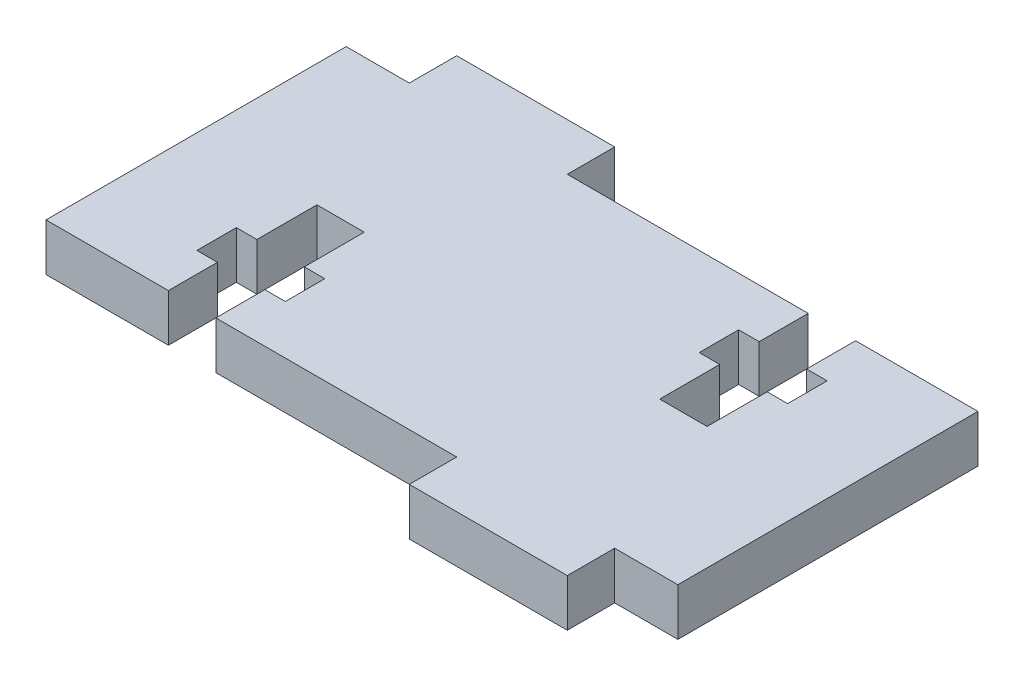
ISO-10303-21;
HEADER;
FILE_DESCRIPTION(('STEP AP214'),'2;1');
FILE_NAME('part.step','',(''),(''),'','','');
FILE_SCHEMA(('AUTOMOTIVE_DESIGN { 1 0 10303 214 1 1 1 1 }'));
ENDSEC;
DATA;
#1=APPLICATION_CONTEXT('core data for automotive mechanical design processes');
#2=APPLICATION_PROTOCOL_DEFINITION('international standard','automotive_design',2000,#1);
#3=PRODUCT_CONTEXT('',#1,'mechanical');
#4=PRODUCT('Part','Part','',(#3));
#5=PRODUCT_RELATED_PRODUCT_CATEGORY('part','',(#4));
#6=PRODUCT_DEFINITION_FORMATION('','',#4);
#7=PRODUCT_DEFINITION_CONTEXT('part definition',#1,'design');
#8=PRODUCT_DEFINITION('design','',#6,#7);
#9=PRODUCT_DEFINITION_SHAPE('','',#8);
#10=(LENGTH_UNIT() NAMED_UNIT(*) SI_UNIT(.MILLI.,.METRE.));
#11=(NAMED_UNIT(*) PLANE_ANGLE_UNIT() SI_UNIT($,.RADIAN.));
#12=(NAMED_UNIT(*) SI_UNIT($,.STERADIAN.) SOLID_ANGLE_UNIT());
#13=UNCERTAINTY_MEASURE_WITH_UNIT(LENGTH_MEASURE(1.E-05),#10,'distance_accuracy_value','');
#14=(GEOMETRIC_REPRESENTATION_CONTEXT(3) GLOBAL_UNCERTAINTY_ASSIGNED_CONTEXT((#13)) GLOBAL_UNIT_ASSIGNED_CONTEXT((#10,
#11,#12)) REPRESENTATION_CONTEXT('',''));
#15=CARTESIAN_POINT('',(0.,0.,0.));
#16=DIRECTION('',(0.,0.,1.));
#17=DIRECTION('',(1.,0.,0.));
#18=AXIS2_PLACEMENT_3D('',#15,#16,#17);
#19=CARTESIAN_POINT('',(0.,3.,0.));
#20=DIRECTION('',(-1.,0.,0.));
#21=DIRECTION('',(0.,0.,1.));
#22=AXIS2_PLACEMENT_3D('',#19,#20,#21);
#23=PLANE('',#22);
#24=DIRECTION('',(0.,0.,-1.));
#25=VECTOR('',#24,1.);
#26=CARTESIAN_POINT('',(0.,0.,0.));
#27=LINE('',#26,#25);
#28=CARTESIAN_POINT('',(0.,0.,0.));
#29=VERTEX_POINT('',#28);
#30=CARTESIAN_POINT('',(0.,0.,-19.));
#31=VERTEX_POINT('',#30);
#32=EDGE_CURVE('E297',#29,#31,#27,.T.);
#33=ORIENTED_EDGE('',*,*,#32,.T.);
#34=DIRECTION('',(0.,-1.,0.));
#35=VECTOR('',#34,1.);
#36=CARTESIAN_POINT('',(0.,3.,-19.));
#37=LINE('',#36,#35);
#38=CARTESIAN_POINT('',(0.,3.,-19.));
#39=VERTEX_POINT('',#38);
#40=EDGE_CURVE('E11',#39,#31,#37,.T.);
#41=ORIENTED_EDGE('',*,*,#40,.F.);
#42=DIRECTION('',(0.,0.,-1.));
#43=VECTOR('',#42,1.);
#44=CARTESIAN_POINT('',(0.,3.,0.));
#45=LINE('',#44,#43);
#46=CARTESIAN_POINT('',(0.,3.,0.));
#47=VERTEX_POINT('',#46);
#48=EDGE_CURVE('E367',#47,#39,#45,.T.);
#49=ORIENTED_EDGE('',*,*,#48,.F.);
#50=DIRECTION('',(0.,-1.,0.));
#51=VECTOR('',#50,1.);
#52=CARTESIAN_POINT('',(0.,3.,0.));
#53=LINE('',#52,#51);
#54=EDGE_CURVE('E293',#47,#29,#53,.T.);
#55=ORIENTED_EDGE('',*,*,#54,.T.);
#56=EDGE_LOOP('',(#33,#41,#49,#55));
#57=FACE_BOUND('',#56,.T.);
#58=ADVANCED_FACE('F33',(#57),#23,.F.);
#59=CARTESIAN_POINT('',(0.,3.,-19.));
#60=DIRECTION('',(0.,0.,1.));
#61=DIRECTION('',(1.,0.,0.));
#62=AXIS2_PLACEMENT_3D('',#59,#60,#61);
#63=PLANE('',#62);
#64=DIRECTION('',(-1.,0.,0.));
#65=VECTOR('',#64,1.);
#66=CARTESIAN_POINT('',(0.,0.,-19.));
#67=LINE('',#66,#65);
#68=CARTESIAN_POINT('',(-7.75,0.,-19.));
#69=VERTEX_POINT('',#68);
#70=EDGE_CURVE('E300',#31,#69,#67,.T.);
#71=ORIENTED_EDGE('',*,*,#70,.T.);
#72=DIRECTION('',(0.,-1.,0.));
#73=VECTOR('',#72,1.);
#74=CARTESIAN_POINT('',(-7.75,3.,-19.));
#75=LINE('',#74,#73);
#76=CARTESIAN_POINT('',(-7.75,3.,-19.));
#77=VERTEX_POINT('',#76);
#78=EDGE_CURVE('E41',#77,#69,#75,.T.);
#79=ORIENTED_EDGE('',*,*,#78,.F.);
#80=DIRECTION('',(-1.,0.,0.));
#81=VECTOR('',#80,1.);
#82=CARTESIAN_POINT('',(0.,3.,-19.));
#83=LINE('',#82,#81);
#84=EDGE_CURVE('E176',#39,#77,#83,.T.);
#85=ORIENTED_EDGE('',*,*,#84,.F.);
#86=ORIENTED_EDGE('',*,*,#40,.T.);
#87=EDGE_LOOP('',(#71,#79,#85,#86));
#88=FACE_BOUND('',#87,.T.);
#89=ADVANCED_FACE('F565',(#88),#63,.F.);
#90=CARTESIAN_POINT('',(-7.75,3.,-19.));
#91=DIRECTION('',(1.,0.,0.));
#92=DIRECTION('',(0.,0.,-1.));
#93=AXIS2_PLACEMENT_3D('',#90,#91,#92);
#94=PLANE('',#93);
#95=DIRECTION('',(0.,0.,1.));
#96=VECTOR('',#95,1.);
#97=CARTESIAN_POINT('',(-7.75,0.,-19.));
#98=LINE('',#97,#96);
#99=CARTESIAN_POINT('',(-7.75,0.,-15.9));
#100=VERTEX_POINT('',#99);
#101=EDGE_CURVE('E302',#69,#100,#98,.T.);
#102=ORIENTED_EDGE('',*,*,#101,.T.);
#103=DIRECTION('',(0.,-1.,0.));
#104=VECTOR('',#103,1.);
#105=CARTESIAN_POINT('',(-7.75,3.,-15.9));
#106=LINE('',#105,#104);
#107=CARTESIAN_POINT('',(-7.75,3.,-15.9));
#108=VERTEX_POINT('',#107);
#109=EDGE_CURVE('E458',#108,#100,#106,.T.);
#110=ORIENTED_EDGE('',*,*,#109,.F.);
#111=DIRECTION('',(0.,0.,1.));
#112=VECTOR('',#111,1.);
#113=CARTESIAN_POINT('',(-7.75,3.,-19.));
#114=LINE('',#113,#112);
#115=EDGE_CURVE('E466',#77,#108,#114,.T.);
#116=ORIENTED_EDGE('',*,*,#115,.F.);
#117=ORIENTED_EDGE('',*,*,#78,.T.);
#118=EDGE_LOOP('',(#102,#110,#116,#117));
#119=FACE_BOUND('',#118,.T.);
#120=ADVANCED_FACE('F464',(#119),#94,.F.);
#121=CARTESIAN_POINT('',(-7.75,3.,-15.9));
#122=DIRECTION('',(0.,0.,-1.));
#123=DIRECTION('',(-1.,0.,0.));
#124=AXIS2_PLACEMENT_3D('',#121,#122,#123);
#125=PLANE('',#124);
#126=DIRECTION('',(1.,0.,0.));
#127=VECTOR('',#126,1.);
#128=CARTESIAN_POINT('',(-7.75,0.,-15.9));
#129=LINE('',#128,#127);
#130=CARTESIAN_POINT('',(-6.45,0.,-15.9));
#131=VERTEX_POINT('',#130);
#132=EDGE_CURVE('E304',#100,#131,#129,.T.);
#133=ORIENTED_EDGE('',*,*,#132,.T.);
#134=DIRECTION('',(0.,-1.,0.));
#135=VECTOR('',#134,1.);
#136=CARTESIAN_POINT('',(-6.45,3.,-15.9));
#137=LINE('',#136,#135);
#138=CARTESIAN_POINT('',(-6.45,3.,-15.9));
#139=VERTEX_POINT('',#138);
#140=EDGE_CURVE('E455',#139,#131,#137,.T.);
#141=ORIENTED_EDGE('',*,*,#140,.F.);
#142=DIRECTION('',(1.,0.,0.));
#143=VECTOR('',#142,1.);
#144=CARTESIAN_POINT('',(-7.75,3.,-15.9));
#145=LINE('',#144,#143);
#146=EDGE_CURVE('E484',#108,#139,#145,.T.);
#147=ORIENTED_EDGE('',*,*,#146,.F.);
#148=ORIENTED_EDGE('',*,*,#109,.T.);
#149=EDGE_LOOP('',(#133,#141,#147,#148));
#150=FACE_BOUND('',#149,.T.);
#151=ADVANCED_FACE('F475',(#150),#125,.F.);
#152=CARTESIAN_POINT('',(-6.45,3.,-15.9));
#153=DIRECTION('',(1.,0.,0.));
#154=DIRECTION('',(0.,0.,-1.));
#155=AXIS2_PLACEMENT_3D('',#152,#153,#154);
#156=PLANE('',#155);
#157=DIRECTION('',(0.,0.,1.));
#158=VECTOR('',#157,1.);
#159=CARTESIAN_POINT('',(-6.45,0.,-15.9));
#160=LINE('',#159,#158);
#161=CARTESIAN_POINT('',(-6.45,0.,-13.4));
#162=VERTEX_POINT('',#161);
#163=EDGE_CURVE('E306',#131,#162,#160,.T.);
#164=ORIENTED_EDGE('',*,*,#163,.T.);
#165=DIRECTION('',(0.,-1.,0.));
#166=VECTOR('',#165,1.);
#167=CARTESIAN_POINT('',(-6.45,3.,-13.4));
#168=LINE('',#167,#166);
#169=CARTESIAN_POINT('',(-6.45,3.,-13.4));
#170=VERTEX_POINT('',#169);
#171=EDGE_CURVE('E452',#170,#162,#168,.T.);
#172=ORIENTED_EDGE('',*,*,#171,.F.);
#173=DIRECTION('',(0.,0.,1.));
#174=VECTOR('',#173,1.);
#175=CARTESIAN_POINT('',(-6.45,3.,-15.9));
#176=LINE('',#175,#174);
#177=EDGE_CURVE('E481',#139,#170,#176,.T.);
#178=ORIENTED_EDGE('',*,*,#177,.F.);
#179=ORIENTED_EDGE('',*,*,#140,.T.);
#180=EDGE_LOOP('',(#164,#172,#178,#179));
#181=FACE_BOUND('',#180,.T.);
#182=ADVANCED_FACE('F479',(#181),#156,.F.);
#183=CARTESIAN_POINT('',(-6.45,3.,-13.4));
#184=DIRECTION('',(0.,0.,1.));
#185=DIRECTION('',(1.,0.,0.));
#186=AXIS2_PLACEMENT_3D('',#183,#184,#185);
#187=PLANE('',#186);
#188=DIRECTION('',(-1.,0.,0.));
#189=VECTOR('',#188,1.);
#190=CARTESIAN_POINT('',(-6.45,0.,-13.4));
#191=LINE('',#190,#189);
#192=CARTESIAN_POINT('',(-7.75,0.,-13.4));
#193=VERTEX_POINT('',#192);
#194=EDGE_CURVE('E308',#162,#193,#191,.T.);
#195=ORIENTED_EDGE('',*,*,#194,.T.);
#196=DIRECTION('',(0.,-1.,0.));
#197=VECTOR('',#196,1.);
#198=CARTESIAN_POINT('',(-7.75,3.,-13.4));
#199=LINE('',#198,#197);
#200=CARTESIAN_POINT('',(-7.75,3.,-13.4));
#201=VERTEX_POINT('',#200);
#202=EDGE_CURVE('E449',#201,#193,#199,.T.);
#203=ORIENTED_EDGE('',*,*,#202,.F.);
#204=DIRECTION('',(-1.,0.,0.));
#205=VECTOR('',#204,1.);
#206=CARTESIAN_POINT('',(-6.45,3.,-13.4));
#207=LINE('',#206,#205);
#208=EDGE_CURVE('E483',#170,#201,#207,.T.);
#209=ORIENTED_EDGE('',*,*,#208,.F.);
#210=ORIENTED_EDGE('',*,*,#171,.T.);
#211=EDGE_LOOP('',(#195,#203,#209,#210));
#212=FACE_BOUND('',#211,.T.);
#213=ADVANCED_FACE('F578',(#212),#187,.F.);
#214=CARTESIAN_POINT('',(-7.75,3.,-13.4));
#215=DIRECTION('',(1.,0.,0.));
#216=DIRECTION('',(0.,0.,-1.));
#217=AXIS2_PLACEMENT_3D('',#214,#215,#216);
#218=PLANE('',#217);
#219=DIRECTION('',(0.,0.,1.));
#220=VECTOR('',#219,1.);
#221=CARTESIAN_POINT('',(-7.75,0.,-13.4));
#222=LINE('',#221,#220);
#223=CARTESIAN_POINT('',(-7.75,0.,-9.6));
#224=VERTEX_POINT('',#223);
#225=EDGE_CURVE('E310',#193,#224,#222,.T.);
#226=ORIENTED_EDGE('',*,*,#225,.T.);
#227=DIRECTION('',(0.,-1.,0.));
#228=VECTOR('',#227,1.);
#229=CARTESIAN_POINT('',(-7.75,3.,-9.6));
#230=LINE('',#229,#228);
#231=CARTESIAN_POINT('',(-7.75,3.,-9.6));
#232=VERTEX_POINT('',#231);
#233=EDGE_CURVE('E446',#232,#224,#230,.T.);
#234=ORIENTED_EDGE('',*,*,#233,.F.);
#235=DIRECTION('',(0.,0.,1.));
#236=VECTOR('',#235,1.);
#237=CARTESIAN_POINT('',(-7.75,3.,-13.4));
#238=LINE('',#237,#236);
#239=EDGE_CURVE('E486',#201,#232,#238,.T.);
#240=ORIENTED_EDGE('',*,*,#239,.F.);
#241=ORIENTED_EDGE('',*,*,#202,.T.);
#242=EDGE_LOOP('',(#226,#234,#240,#241));
#243=FACE_BOUND('',#242,.T.);
#244=ADVANCED_FACE('F581',(#243),#218,.F.);
#245=CARTESIAN_POINT('',(-7.75,3.,-9.6));
#246=DIRECTION('',(0.,0.,1.));
#247=DIRECTION('',(1.,0.,0.));
#248=AXIS2_PLACEMENT_3D('',#245,#246,#247);
#249=PLANE('',#248);
#250=DIRECTION('',(-1.,0.,0.));
#251=VECTOR('',#250,1.);
#252=CARTESIAN_POINT('',(-7.75,0.,-9.6));
#253=LINE('',#252,#251);
#254=CARTESIAN_POINT('',(-10.75,0.,-9.6));
#255=VERTEX_POINT('',#254);
#256=EDGE_CURVE('E312',#224,#255,#253,.T.);
#257=ORIENTED_EDGE('',*,*,#256,.T.);
#258=DIRECTION('',(0.,-1.,0.));
#259=VECTOR('',#258,1.);
#260=CARTESIAN_POINT('',(-10.75,3.,-9.6));
#261=LINE('',#260,#259);
#262=CARTESIAN_POINT('',(-10.75,3.,-9.6));
#263=VERTEX_POINT('',#262);
#264=EDGE_CURVE('E443',#263,#255,#261,.T.);
#265=ORIENTED_EDGE('',*,*,#264,.F.);
#266=DIRECTION('',(-1.,0.,0.));
#267=VECTOR('',#266,1.);
#268=CARTESIAN_POINT('',(-7.75,3.,-9.6));
#269=LINE('',#268,#267);
#270=EDGE_CURVE('E492',#232,#263,#269,.T.);
#271=ORIENTED_EDGE('',*,*,#270,.F.);
#272=ORIENTED_EDGE('',*,*,#233,.T.);
#273=EDGE_LOOP('',(#257,#265,#271,#272));
#274=FACE_BOUND('',#273,.T.);
#275=ADVANCED_FACE('F585',(#274),#249,.F.);
#276=CARTESIAN_POINT('',(-10.75,3.,-9.6));
#277=DIRECTION('',(-1.,0.,0.));
#278=DIRECTION('',(0.,0.,1.));
#279=AXIS2_PLACEMENT_3D('',#276,#277,#278);
#280=PLANE('',#279);
#281=DIRECTION('',(0.,0.,-1.));
#282=VECTOR('',#281,1.);
#283=CARTESIAN_POINT('',(-10.75,0.,-9.6));
#284=LINE('',#283,#282);
#285=CARTESIAN_POINT('',(-10.75,0.,-13.4));
#286=VERTEX_POINT('',#285);
#287=EDGE_CURVE('E314',#255,#286,#284,.T.);
#288=ORIENTED_EDGE('',*,*,#287,.T.);
#289=DIRECTION('',(0.,-1.,0.));
#290=VECTOR('',#289,1.);
#291=CARTESIAN_POINT('',(-10.75,3.,-13.4));
#292=LINE('',#291,#290);
#293=CARTESIAN_POINT('',(-10.75,3.,-13.4));
#294=VERTEX_POINT('',#293);
#295=EDGE_CURVE('E440',#294,#286,#292,.T.);
#296=ORIENTED_EDGE('',*,*,#295,.F.);
#297=DIRECTION('',(0.,0.,-1.));
#298=VECTOR('',#297,1.);
#299=CARTESIAN_POINT('',(-10.75,3.,-9.6));
#300=LINE('',#299,#298);
#301=EDGE_CURVE('E494',#263,#294,#300,.T.);
#302=ORIENTED_EDGE('',*,*,#301,.F.);
#303=ORIENTED_EDGE('',*,*,#264,.T.);
#304=EDGE_LOOP('',(#288,#296,#302,#303));
#305=FACE_BOUND('',#304,.T.);
#306=ADVANCED_FACE('F589',(#305),#280,.F.);
#307=CARTESIAN_POINT('',(-10.75,3.,-13.4));
#308=DIRECTION('',(0.,0.,1.));
#309=DIRECTION('',(1.,0.,0.));
#310=AXIS2_PLACEMENT_3D('',#307,#308,#309);
#311=PLANE('',#310);
#312=DIRECTION('',(-1.,0.,0.));
#313=VECTOR('',#312,1.);
#314=CARTESIAN_POINT('',(-10.75,0.,-13.4));
#315=LINE('',#314,#313);
#316=CARTESIAN_POINT('',(-12.05,0.,-13.4));
#317=VERTEX_POINT('',#316);
#318=EDGE_CURVE('E316',#286,#317,#315,.T.);
#319=ORIENTED_EDGE('',*,*,#318,.T.);
#320=DIRECTION('',(0.,-1.,0.));
#321=VECTOR('',#320,1.);
#322=CARTESIAN_POINT('',(-12.05,3.,-13.4));
#323=LINE('',#322,#321);
#324=CARTESIAN_POINT('',(-12.05,3.,-13.4));
#325=VERTEX_POINT('',#324);
#326=EDGE_CURVE('E437',#325,#317,#323,.T.);
#327=ORIENTED_EDGE('',*,*,#326,.F.);
#328=DIRECTION('',(-1.,0.,0.));
#329=VECTOR('',#328,1.);
#330=CARTESIAN_POINT('',(-10.75,3.,-13.4));
#331=LINE('',#330,#329);
#332=EDGE_CURVE('E496',#294,#325,#331,.T.);
#333=ORIENTED_EDGE('',*,*,#332,.F.);
#334=ORIENTED_EDGE('',*,*,#295,.T.);
#335=EDGE_LOOP('',(#319,#327,#333,#334));
#336=FACE_BOUND('',#335,.T.);
#337=ADVANCED_FACE('F593',(#336),#311,.F.);
#338=CARTESIAN_POINT('',(-12.05,3.,-13.4));
#339=DIRECTION('',(-1.,0.,0.));
#340=DIRECTION('',(0.,0.,1.));
#341=AXIS2_PLACEMENT_3D('',#338,#339,#340);
#342=PLANE('',#341);
#343=DIRECTION('',(0.,0.,-1.));
#344=VECTOR('',#343,1.);
#345=CARTESIAN_POINT('',(-12.05,0.,-13.4));
#346=LINE('',#345,#344);
#347=CARTESIAN_POINT('',(-12.05,0.,-15.9));
#348=VERTEX_POINT('',#347);
#349=EDGE_CURVE('E318',#317,#348,#346,.T.);
#350=ORIENTED_EDGE('',*,*,#349,.T.);
#351=DIRECTION('',(0.,-1.,0.));
#352=VECTOR('',#351,1.);
#353=CARTESIAN_POINT('',(-12.05,3.,-15.9));
#354=LINE('',#353,#352);
#355=CARTESIAN_POINT('',(-12.05,3.,-15.9));
#356=VERTEX_POINT('',#355);
#357=EDGE_CURVE('E434',#356,#348,#354,.T.);
#358=ORIENTED_EDGE('',*,*,#357,.F.);
#359=DIRECTION('',(0.,0.,-1.));
#360=VECTOR('',#359,1.);
#361=CARTESIAN_POINT('',(-12.05,3.,-13.4));
#362=LINE('',#361,#360);
#363=EDGE_CURVE('E498',#325,#356,#362,.T.);
#364=ORIENTED_EDGE('',*,*,#363,.F.);
#365=ORIENTED_EDGE('',*,*,#326,.T.);
#366=EDGE_LOOP('',(#350,#358,#364,#365));
#367=FACE_BOUND('',#366,.T.);
#368=ADVANCED_FACE('F597',(#367),#342,.F.);
#369=CARTESIAN_POINT('',(-12.05,3.,-15.9));
#370=DIRECTION('',(0.,0.,-1.));
#371=DIRECTION('',(-1.,0.,0.));
#372=AXIS2_PLACEMENT_3D('',#369,#370,#371);
#373=PLANE('',#372);
#374=DIRECTION('',(1.,0.,0.));
#375=VECTOR('',#374,1.);
#376=CARTESIAN_POINT('',(-12.05,0.,-15.9));
#377=LINE('',#376,#375);
#378=CARTESIAN_POINT('',(-10.75,0.,-15.9));
#379=VERTEX_POINT('',#378);
#380=EDGE_CURVE('E320',#348,#379,#377,.T.);
#381=ORIENTED_EDGE('',*,*,#380,.T.);
#382=DIRECTION('',(0.,-1.,0.));
#383=VECTOR('',#382,1.);
#384=CARTESIAN_POINT('',(-10.75,3.,-15.9));
#385=LINE('',#384,#383);
#386=CARTESIAN_POINT('',(-10.75,3.,-15.9));
#387=VERTEX_POINT('',#386);
#388=EDGE_CURVE('E431',#387,#379,#385,.T.);
#389=ORIENTED_EDGE('',*,*,#388,.F.);
#390=DIRECTION('',(1.,0.,0.));
#391=VECTOR('',#390,1.);
#392=CARTESIAN_POINT('',(-12.05,3.,-15.9));
#393=LINE('',#392,#391);
#394=EDGE_CURVE('E500',#356,#387,#393,.T.);
#395=ORIENTED_EDGE('',*,*,#394,.F.);
#396=ORIENTED_EDGE('',*,*,#357,.T.);
#397=EDGE_LOOP('',(#381,#389,#395,#396));
#398=FACE_BOUND('',#397,.T.);
#399=ADVANCED_FACE('F601',(#398),#373,.F.);
#400=CARTESIAN_POINT('',(-10.75,3.,-15.9));
#401=DIRECTION('',(-1.,0.,0.));
#402=DIRECTION('',(0.,0.,1.));
#403=AXIS2_PLACEMENT_3D('',#400,#401,#402);
#404=PLANE('',#403);
#405=DIRECTION('',(0.,0.,-1.));
#406=VECTOR('',#405,1.);
#407=CARTESIAN_POINT('',(-10.75,0.,-15.9));
#408=LINE('',#407,#406);
#409=CARTESIAN_POINT('',(-10.75,0.,-19.));
#410=VERTEX_POINT('',#409);
#411=EDGE_CURVE('E322',#379,#410,#408,.T.);
#412=ORIENTED_EDGE('',*,*,#411,.T.);
#413=DIRECTION('',(0.,-1.,0.));
#414=VECTOR('',#413,1.);
#415=CARTESIAN_POINT('',(-10.75,3.,-19.));
#416=LINE('',#415,#414);
#417=CARTESIAN_POINT('',(-10.75,3.,-19.));
#418=VERTEX_POINT('',#417);
#419=EDGE_CURVE('E428',#418,#410,#416,.T.);
#420=ORIENTED_EDGE('',*,*,#419,.F.);
#421=DIRECTION('',(0.,0.,-1.));
#422=VECTOR('',#421,1.);
#423=CARTESIAN_POINT('',(-10.75,3.,-15.9));
#424=LINE('',#423,#422);
#425=EDGE_CURVE('E502',#387,#418,#424,.T.);
#426=ORIENTED_EDGE('',*,*,#425,.F.);
#427=ORIENTED_EDGE('',*,*,#388,.T.);
#428=EDGE_LOOP('',(#412,#420,#426,#427));
#429=FACE_BOUND('',#428,.T.);
#430=ADVANCED_FACE('F605',(#429),#404,.F.);
#431=CARTESIAN_POINT('',(-10.75,3.,-19.));
#432=DIRECTION('',(0.,0.,1.));
#433=DIRECTION('',(1.,0.,0.));
#434=AXIS2_PLACEMENT_3D('',#431,#432,#433);
#435=PLANE('',#434);
#436=DIRECTION('',(-1.,0.,0.));
#437=VECTOR('',#436,1.);
#438=CARTESIAN_POINT('',(-10.75,0.,-19.));
#439=LINE('',#438,#437);
#440=CARTESIAN_POINT('',(-26.,0.,-19.));
#441=VERTEX_POINT('',#440);
#442=EDGE_CURVE('E324',#410,#441,#439,.T.);
#443=ORIENTED_EDGE('',*,*,#442,.T.);
#444=DIRECTION('',(0.,-1.,0.));
#445=VECTOR('',#444,1.);
#446=CARTESIAN_POINT('',(-26.,3.,-19.));
#447=LINE('',#446,#445);
#448=CARTESIAN_POINT('',(-26.,3.,-19.));
#449=VERTEX_POINT('',#448);
#450=EDGE_CURVE('E425',#449,#441,#447,.T.);
#451=ORIENTED_EDGE('',*,*,#450,.F.);
#452=DIRECTION('',(-1.,0.,0.));
#453=VECTOR('',#452,1.);
#454=CARTESIAN_POINT('',(-10.75,3.,-19.));
#455=LINE('',#454,#453);
#456=EDGE_CURVE('E504',#418,#449,#455,.T.);
#457=ORIENTED_EDGE('',*,*,#456,.F.);
#458=ORIENTED_EDGE('',*,*,#419,.T.);
#459=EDGE_LOOP('',(#443,#451,#457,#458));
#460=FACE_BOUND('',#459,.T.);
#461=ADVANCED_FACE('F609',(#460),#435,.F.);
#462=CARTESIAN_POINT('',(-26.,3.,-19.));
#463=DIRECTION('',(-1.,0.,0.));
#464=DIRECTION('',(0.,0.,1.));
#465=AXIS2_PLACEMENT_3D('',#462,#463,#464);
#466=PLANE('',#465);
#467=DIRECTION('',(0.,0.,-1.));
#468=VECTOR('',#467,1.);
#469=CARTESIAN_POINT('',(-26.,0.,-19.));
#470=LINE('',#469,#468);
#471=CARTESIAN_POINT('',(-26.,0.,-22.));
#472=VERTEX_POINT('',#471);
#473=EDGE_CURVE('E326',#441,#472,#470,.T.);
#474=ORIENTED_EDGE('',*,*,#473,.T.);
#475=DIRECTION('',(0.,-1.,0.));
#476=VECTOR('',#475,1.);
#477=CARTESIAN_POINT('',(-26.,3.,-22.));
#478=LINE('',#477,#476);
#479=CARTESIAN_POINT('',(-26.,3.,-22.));
#480=VERTEX_POINT('',#479);
#481=EDGE_CURVE('E422',#480,#472,#478,.T.);
#482=ORIENTED_EDGE('',*,*,#481,.F.);
#483=DIRECTION('',(0.,0.,-1.));
#484=VECTOR('',#483,1.);
#485=CARTESIAN_POINT('',(-26.,3.,-19.));
#486=LINE('',#485,#484);
#487=EDGE_CURVE('E506',#449,#480,#486,.T.);
#488=ORIENTED_EDGE('',*,*,#487,.F.);
#489=ORIENTED_EDGE('',*,*,#450,.T.);
#490=EDGE_LOOP('',(#474,#482,#488,#489));
#491=FACE_BOUND('',#490,.T.);
#492=ADVANCED_FACE('F613',(#491),#466,.F.);
#493=CARTESIAN_POINT('',(-26.,3.,-22.));
#494=DIRECTION('',(0.,0.,1.));
#495=DIRECTION('',(1.,0.,0.));
#496=AXIS2_PLACEMENT_3D('',#493,#494,#495);
#497=PLANE('',#496);
#498=DIRECTION('',(-1.,0.,0.));
#499=VECTOR('',#498,1.);
#500=CARTESIAN_POINT('',(-26.,0.,-22.));
#501=LINE('',#500,#499);
#502=CARTESIAN_POINT('',(-36.,0.,-22.));
#503=VERTEX_POINT('',#502);
#504=EDGE_CURVE('E328',#472,#503,#501,.T.);
#505=ORIENTED_EDGE('',*,*,#504,.T.);
#506=DIRECTION('',(0.,-1.,0.));
#507=VECTOR('',#506,1.);
#508=CARTESIAN_POINT('',(-36.,3.,-22.));
#509=LINE('',#508,#507);
#510=CARTESIAN_POINT('',(-36.,3.,-22.));
#511=VERTEX_POINT('',#510);
#512=EDGE_CURVE('E419',#511,#503,#509,.T.);
#513=ORIENTED_EDGE('',*,*,#512,.F.);
#514=DIRECTION('',(-1.,0.,0.));
#515=VECTOR('',#514,1.);
#516=CARTESIAN_POINT('',(-26.,3.,-22.));
#517=LINE('',#516,#515);
#518=EDGE_CURVE('E508',#480,#511,#517,.T.);
#519=ORIENTED_EDGE('',*,*,#518,.F.);
#520=ORIENTED_EDGE('',*,*,#481,.T.);
#521=EDGE_LOOP('',(#505,#513,#519,#520));
#522=FACE_BOUND('',#521,.T.);
#523=ADVANCED_FACE('F617',(#522),#497,.F.);
#524=CARTESIAN_POINT('',(-36.,3.,-22.));
#525=DIRECTION('',(1.,0.,0.));
#526=DIRECTION('',(0.,0.,-1.));
#527=AXIS2_PLACEMENT_3D('',#524,#525,#526);
#528=PLANE('',#527);
#529=DIRECTION('',(0.,0.,1.));
#530=VECTOR('',#529,1.);
#531=CARTESIAN_POINT('',(-36.,0.,-22.));
#532=LINE('',#531,#530);
#533=CARTESIAN_POINT('',(-36.,0.,-19.));
#534=VERTEX_POINT('',#533);
#535=EDGE_CURVE('E330',#503,#534,#532,.T.);
#536=ORIENTED_EDGE('',*,*,#535,.T.);
#537=DIRECTION('',(0.,-1.,0.));
#538=VECTOR('',#537,1.);
#539=CARTESIAN_POINT('',(-36.,3.,-19.));
#540=LINE('',#539,#538);
#541=CARTESIAN_POINT('',(-36.,3.,-19.));
#542=VERTEX_POINT('',#541);
#543=EDGE_CURVE('E416',#542,#534,#540,.T.);
#544=ORIENTED_EDGE('',*,*,#543,.F.);
#545=DIRECTION('',(0.,0.,1.));
#546=VECTOR('',#545,1.);
#547=CARTESIAN_POINT('',(-36.,3.,-22.));
#548=LINE('',#547,#546);
#549=EDGE_CURVE('E510',#511,#542,#548,.T.);
#550=ORIENTED_EDGE('',*,*,#549,.F.);
#551=ORIENTED_EDGE('',*,*,#512,.T.);
#552=EDGE_LOOP('',(#536,#544,#550,#551));
#553=FACE_BOUND('',#552,.T.);
#554=ADVANCED_FACE('F621',(#553),#528,.F.);
#555=CARTESIAN_POINT('',(-36.,3.,-19.));
#556=DIRECTION('',(0.,0.,1.));
#557=DIRECTION('',(1.,0.,0.));
#558=AXIS2_PLACEMENT_3D('',#555,#556,#557);
#559=PLANE('',#558);
#560=DIRECTION('',(-1.,0.,0.));
#561=VECTOR('',#560,1.);
#562=CARTESIAN_POINT('',(-36.,0.,-19.));
#563=LINE('',#562,#561);
#564=CARTESIAN_POINT('',(-40.,0.,-19.));
#565=VERTEX_POINT('',#564);
#566=EDGE_CURVE('E332',#534,#565,#563,.T.);
#567=ORIENTED_EDGE('',*,*,#566,.T.);
#568=DIRECTION('',(0.,-1.,0.));
#569=VECTOR('',#568,1.);
#570=CARTESIAN_POINT('',(-40.,3.,-19.));
#571=LINE('',#570,#569);
#572=CARTESIAN_POINT('',(-40.,3.,-19.));
#573=VERTEX_POINT('',#572);
#574=EDGE_CURVE('E413',#573,#565,#571,.T.);
#575=ORIENTED_EDGE('',*,*,#574,.F.);
#576=DIRECTION('',(-1.,0.,0.));
#577=VECTOR('',#576,1.);
#578=CARTESIAN_POINT('',(-36.,3.,-19.));
#579=LINE('',#578,#577);
#580=EDGE_CURVE('E512',#542,#573,#579,.T.);
#581=ORIENTED_EDGE('',*,*,#580,.F.);
#582=ORIENTED_EDGE('',*,*,#543,.T.);
#583=EDGE_LOOP('',(#567,#575,#581,#582));
#584=FACE_BOUND('',#583,.T.);
#585=ADVANCED_FACE('F625',(#584),#559,.F.);
#586=CARTESIAN_POINT('',(-40.,3.,0.));
#587=DIRECTION('',(1.,0.,0.));
#588=DIRECTION('',(0.,0.,-1.));
#589=AXIS2_PLACEMENT_3D('',#586,#587,#588);
#590=PLANE('',#589);
#591=DIRECTION('',(0.,0.,1.));
#592=VECTOR('',#591,1.);
#593=CARTESIAN_POINT('',(-40.,0.,0.));
#594=LINE('',#593,#592);
#595=CARTESIAN_POINT('',(-40.,0.,0.));
#596=VERTEX_POINT('',#595);
#597=EDGE_CURVE('E334',#565,#596,#594,.T.);
#598=ORIENTED_EDGE('',*,*,#597,.T.);
#599=DIRECTION('',(0.,-1.,0.));
#600=VECTOR('',#599,1.);
#601=CARTESIAN_POINT('',(-40.,3.,0.));
#602=LINE('',#601,#600);
#603=CARTESIAN_POINT('',(-40.,3.,0.));
#604=VERTEX_POINT('',#603);
#605=EDGE_CURVE('E410',#604,#596,#602,.T.);
#606=ORIENTED_EDGE('',*,*,#605,.F.);
#607=DIRECTION('',(0.,0.,1.));
#608=VECTOR('',#607,1.);
#609=CARTESIAN_POINT('',(-40.,3.,0.));
#610=LINE('',#609,#608);
#611=EDGE_CURVE('E514',#573,#604,#610,.T.);
#612=ORIENTED_EDGE('',*,*,#611,.F.);
#613=ORIENTED_EDGE('',*,*,#574,.T.);
#614=EDGE_LOOP('',(#598,#606,#612,#613));
#615=FACE_BOUND('',#614,.T.);
#616=ADVANCED_FACE('F629',(#615),#590,.F.);
#617=CARTESIAN_POINT('',(-32.25,3.,0.));
#618=DIRECTION('',(0.,0.,-1.));
#619=DIRECTION('',(-1.,0.,0.));
#620=AXIS2_PLACEMENT_3D('',#617,#618,#619);
#621=PLANE('',#620);
#622=DIRECTION('',(1.,0.,0.));
#623=VECTOR('',#622,1.);
#624=CARTESIAN_POINT('',(-32.25,0.,0.));
#625=LINE('',#624,#623);
#626=CARTESIAN_POINT('',(-32.25,0.,0.));
#627=VERTEX_POINT('',#626);
#628=EDGE_CURVE('E336',#596,#627,#625,.T.);
#629=ORIENTED_EDGE('',*,*,#628,.T.);
#630=DIRECTION('',(0.,-1.,0.));
#631=VECTOR('',#630,1.);
#632=CARTESIAN_POINT('',(-32.25,3.,0.));
#633=LINE('',#632,#631);
#634=CARTESIAN_POINT('',(-32.25,3.,0.));
#635=VERTEX_POINT('',#634);
#636=EDGE_CURVE('E407',#635,#627,#633,.T.);
#637=ORIENTED_EDGE('',*,*,#636,.F.);
#638=DIRECTION('',(1.,0.,0.));
#639=VECTOR('',#638,1.);
#640=CARTESIAN_POINT('',(-32.25,3.,0.));
#641=LINE('',#640,#639);
#642=EDGE_CURVE('E516',#604,#635,#641,.T.);
#643=ORIENTED_EDGE('',*,*,#642,.F.);
#644=ORIENTED_EDGE('',*,*,#605,.T.);
#645=EDGE_LOOP('',(#629,#637,#643,#644));
#646=FACE_BOUND('',#645,.T.);
#647=ADVANCED_FACE('F633',(#646),#621,.F.);
#648=CARTESIAN_POINT('',(-32.25,3.,-3.1));
#649=DIRECTION('',(-1.,0.,0.));
#650=DIRECTION('',(0.,0.,1.));
#651=AXIS2_PLACEMENT_3D('',#648,#649,#650);
#652=PLANE('',#651);
#653=DIRECTION('',(0.,0.,-1.));
#654=VECTOR('',#653,1.);
#655=CARTESIAN_POINT('',(-32.25,0.,-3.1));
#656=LINE('',#655,#654);
#657=CARTESIAN_POINT('',(-32.25,0.,-3.1));
#658=VERTEX_POINT('',#657);
#659=EDGE_CURVE('E338',#627,#658,#656,.T.);
#660=ORIENTED_EDGE('',*,*,#659,.T.);
#661=DIRECTION('',(0.,-1.,0.));
#662=VECTOR('',#661,1.);
#663=CARTESIAN_POINT('',(-32.25,3.,-3.1));
#664=LINE('',#663,#662);
#665=CARTESIAN_POINT('',(-32.25,3.,-3.1));
#666=VERTEX_POINT('',#665);
#667=EDGE_CURVE('E404',#666,#658,#664,.T.);
#668=ORIENTED_EDGE('',*,*,#667,.F.);
#669=DIRECTION('',(0.,0.,-1.));
#670=VECTOR('',#669,1.);
#671=CARTESIAN_POINT('',(-32.25,3.,-3.1));
#672=LINE('',#671,#670);
#673=EDGE_CURVE('E518',#635,#666,#672,.T.);
#674=ORIENTED_EDGE('',*,*,#673,.F.);
#675=ORIENTED_EDGE('',*,*,#636,.T.);
#676=EDGE_LOOP('',(#660,#668,#674,#675));
#677=FACE_BOUND('',#676,.T.);
#678=ADVANCED_FACE('F637',(#677),#652,.F.);
#679=CARTESIAN_POINT('',(-33.55,3.,-3.1));
#680=DIRECTION('',(0.,0.,1.));
#681=DIRECTION('',(1.,0.,0.));
#682=AXIS2_PLACEMENT_3D('',#679,#680,#681);
#683=PLANE('',#682);
#684=DIRECTION('',(-1.,0.,0.));
#685=VECTOR('',#684,1.);
#686=CARTESIAN_POINT('',(-33.55,0.,-3.1));
#687=LINE('',#686,#685);
#688=CARTESIAN_POINT('',(-33.55,0.,-3.1));
#689=VERTEX_POINT('',#688);
#690=EDGE_CURVE('E340',#658,#689,#687,.T.);
#691=ORIENTED_EDGE('',*,*,#690,.T.);
#692=DIRECTION('',(0.,-1.,0.));
#693=VECTOR('',#692,1.);
#694=CARTESIAN_POINT('',(-33.55,3.,-3.1));
#695=LINE('',#694,#693);
#696=CARTESIAN_POINT('',(-33.55,3.,-3.1));
#697=VERTEX_POINT('',#696);
#698=EDGE_CURVE('E401',#697,#689,#695,.T.);
#699=ORIENTED_EDGE('',*,*,#698,.F.);
#700=DIRECTION('',(-1.,0.,0.));
#701=VECTOR('',#700,1.);
#702=CARTESIAN_POINT('',(-33.55,3.,-3.1));
#703=LINE('',#702,#701);
#704=EDGE_CURVE('E520',#666,#697,#703,.T.);
#705=ORIENTED_EDGE('',*,*,#704,.F.);
#706=ORIENTED_EDGE('',*,*,#667,.T.);
#707=EDGE_LOOP('',(#691,#699,#705,#706));
#708=FACE_BOUND('',#707,.T.);
#709=ADVANCED_FACE('F641',(#708),#683,.F.);
#710=CARTESIAN_POINT('',(-33.55,3.,-5.6));
#711=DIRECTION('',(-1.,0.,0.));
#712=DIRECTION('',(0.,0.,1.));
#713=AXIS2_PLACEMENT_3D('',#710,#711,#712);
#714=PLANE('',#713);
#715=DIRECTION('',(0.,0.,-1.));
#716=VECTOR('',#715,1.);
#717=CARTESIAN_POINT('',(-33.55,0.,-5.6));
#718=LINE('',#717,#716);
#719=CARTESIAN_POINT('',(-33.55,0.,-5.6));
#720=VERTEX_POINT('',#719);
#721=EDGE_CURVE('E342',#689,#720,#718,.T.);
#722=ORIENTED_EDGE('',*,*,#721,.T.);
#723=DIRECTION('',(0.,-1.,0.));
#724=VECTOR('',#723,1.);
#725=CARTESIAN_POINT('',(-33.55,3.,-5.6));
#726=LINE('',#725,#724);
#727=CARTESIAN_POINT('',(-33.55,3.,-5.6));
#728=VERTEX_POINT('',#727);
#729=EDGE_CURVE('E398',#728,#720,#726,.T.);
#730=ORIENTED_EDGE('',*,*,#729,.F.);
#731=DIRECTION('',(0.,0.,-1.));
#732=VECTOR('',#731,1.);
#733=CARTESIAN_POINT('',(-33.55,3.,-5.6));
#734=LINE('',#733,#732);
#735=EDGE_CURVE('E522',#697,#728,#734,.T.);
#736=ORIENTED_EDGE('',*,*,#735,.F.);
#737=ORIENTED_EDGE('',*,*,#698,.T.);
#738=EDGE_LOOP('',(#722,#730,#736,#737));
#739=FACE_BOUND('',#738,.T.);
#740=ADVANCED_FACE('F645',(#739),#714,.F.);
#741=CARTESIAN_POINT('',(-32.25,3.,-5.6));
#742=DIRECTION('',(0.,0.,-1.));
#743=DIRECTION('',(-1.,0.,0.));
#744=AXIS2_PLACEMENT_3D('',#741,#742,#743);
#745=PLANE('',#744);
#746=DIRECTION('',(1.,0.,0.));
#747=VECTOR('',#746,1.);
#748=CARTESIAN_POINT('',(-32.25,0.,-5.6));
#749=LINE('',#748,#747);
#750=CARTESIAN_POINT('',(-32.25,0.,-5.6));
#751=VERTEX_POINT('',#750);
#752=EDGE_CURVE('E344',#720,#751,#749,.T.);
#753=ORIENTED_EDGE('',*,*,#752,.T.);
#754=DIRECTION('',(0.,-1.,0.));
#755=VECTOR('',#754,1.);
#756=CARTESIAN_POINT('',(-32.25,3.,-5.6));
#757=LINE('',#756,#755);
#758=CARTESIAN_POINT('',(-32.25,3.,-5.6));
#759=VERTEX_POINT('',#758);
#760=EDGE_CURVE('E395',#759,#751,#757,.T.);
#761=ORIENTED_EDGE('',*,*,#760,.F.);
#762=DIRECTION('',(1.,0.,0.));
#763=VECTOR('',#762,1.);
#764=CARTESIAN_POINT('',(-32.25,3.,-5.6));
#765=LINE('',#764,#763);
#766=EDGE_CURVE('E524',#728,#759,#765,.T.);
#767=ORIENTED_EDGE('',*,*,#766,.F.);
#768=ORIENTED_EDGE('',*,*,#729,.T.);
#769=EDGE_LOOP('',(#753,#761,#767,#768));
#770=FACE_BOUND('',#769,.T.);
#771=ADVANCED_FACE('F649',(#770),#745,.F.);
#772=CARTESIAN_POINT('',(-32.25,3.,-9.4));
#773=DIRECTION('',(-1.,0.,0.));
#774=DIRECTION('',(0.,0.,1.));
#775=AXIS2_PLACEMENT_3D('',#772,#773,#774);
#776=PLANE('',#775);
#777=DIRECTION('',(0.,0.,-1.));
#778=VECTOR('',#777,1.);
#779=CARTESIAN_POINT('',(-32.25,0.,-9.4));
#780=LINE('',#779,#778);
#781=CARTESIAN_POINT('',(-32.25,0.,-9.4));
#782=VERTEX_POINT('',#781);
#783=EDGE_CURVE('E346',#751,#782,#780,.T.);
#784=ORIENTED_EDGE('',*,*,#783,.T.);
#785=DIRECTION('',(0.,-1.,0.));
#786=VECTOR('',#785,1.);
#787=CARTESIAN_POINT('',(-32.25,3.,-9.4));
#788=LINE('',#787,#786);
#789=CARTESIAN_POINT('',(-32.25,3.,-9.4));
#790=VERTEX_POINT('',#789);
#791=EDGE_CURVE('E392',#790,#782,#788,.T.);
#792=ORIENTED_EDGE('',*,*,#791,.F.);
#793=DIRECTION('',(0.,0.,-1.));
#794=VECTOR('',#793,1.);
#795=CARTESIAN_POINT('',(-32.25,3.,-9.4));
#796=LINE('',#795,#794);
#797=EDGE_CURVE('E526',#759,#790,#796,.T.);
#798=ORIENTED_EDGE('',*,*,#797,.F.);
#799=ORIENTED_EDGE('',*,*,#760,.T.);
#800=EDGE_LOOP('',(#784,#792,#798,#799));
#801=FACE_BOUND('',#800,.T.);
#802=ADVANCED_FACE('F653',(#801),#776,.F.);
#803=CARTESIAN_POINT('',(-29.25,3.,-9.4));
#804=DIRECTION('',(0.,0.,-1.));
#805=DIRECTION('',(-1.,0.,0.));
#806=AXIS2_PLACEMENT_3D('',#803,#804,#805);
#807=PLANE('',#806);
#808=DIRECTION('',(1.,0.,0.));
#809=VECTOR('',#808,1.);
#810=CARTESIAN_POINT('',(-29.25,0.,-9.4));
#811=LINE('',#810,#809);
#812=CARTESIAN_POINT('',(-29.25,0.,-9.4));
#813=VERTEX_POINT('',#812);
#814=EDGE_CURVE('E348',#782,#813,#811,.T.);
#815=ORIENTED_EDGE('',*,*,#814,.T.);
#816=DIRECTION('',(0.,-1.,0.));
#817=VECTOR('',#816,1.);
#818=CARTESIAN_POINT('',(-29.25,3.,-9.4));
#819=LINE('',#818,#817);
#820=CARTESIAN_POINT('',(-29.25,3.,-9.4));
#821=VERTEX_POINT('',#820);
#822=EDGE_CURVE('E389',#821,#813,#819,.T.);
#823=ORIENTED_EDGE('',*,*,#822,.F.);
#824=DIRECTION('',(1.,0.,0.));
#825=VECTOR('',#824,1.);
#826=CARTESIAN_POINT('',(-29.25,3.,-9.4));
#827=LINE('',#826,#825);
#828=EDGE_CURVE('E528',#790,#821,#827,.T.);
#829=ORIENTED_EDGE('',*,*,#828,.F.);
#830=ORIENTED_EDGE('',*,*,#791,.T.);
#831=EDGE_LOOP('',(#815,#823,#829,#830));
#832=FACE_BOUND('',#831,.T.);
#833=ADVANCED_FACE('F657',(#832),#807,.F.);
#834=CARTESIAN_POINT('',(-29.25,3.,-5.6));
#835=DIRECTION('',(1.,0.,0.));
#836=DIRECTION('',(0.,0.,-1.));
#837=AXIS2_PLACEMENT_3D('',#834,#835,#836);
#838=PLANE('',#837);
#839=DIRECTION('',(0.,0.,1.));
#840=VECTOR('',#839,1.);
#841=CARTESIAN_POINT('',(-29.25,0.,-5.6));
#842=LINE('',#841,#840);
#843=CARTESIAN_POINT('',(-29.25,0.,-5.6));
#844=VERTEX_POINT('',#843);
#845=EDGE_CURVE('E350',#813,#844,#842,.T.);
#846=ORIENTED_EDGE('',*,*,#845,.T.);
#847=DIRECTION('',(0.,-1.,0.));
#848=VECTOR('',#847,1.);
#849=CARTESIAN_POINT('',(-29.25,3.,-5.6));
#850=LINE('',#849,#848);
#851=CARTESIAN_POINT('',(-29.25,3.,-5.6));
#852=VERTEX_POINT('',#851);
#853=EDGE_CURVE('E386',#852,#844,#850,.T.);
#854=ORIENTED_EDGE('',*,*,#853,.F.);
#855=DIRECTION('',(0.,0.,1.));
#856=VECTOR('',#855,1.);
#857=CARTESIAN_POINT('',(-29.25,3.,-5.6));
#858=LINE('',#857,#856);
#859=EDGE_CURVE('E530',#821,#852,#858,.T.);
#860=ORIENTED_EDGE('',*,*,#859,.F.);
#861=ORIENTED_EDGE('',*,*,#822,.T.);
#862=EDGE_LOOP('',(#846,#854,#860,#861));
#863=FACE_BOUND('',#862,.T.);
#864=ADVANCED_FACE('F661',(#863),#838,.F.);
#865=CARTESIAN_POINT('',(-27.95,3.,-5.6));
#866=DIRECTION('',(0.,0.,-1.));
#867=DIRECTION('',(-1.,0.,0.));
#868=AXIS2_PLACEMENT_3D('',#865,#866,#867);
#869=PLANE('',#868);
#870=DIRECTION('',(1.,0.,0.));
#871=VECTOR('',#870,1.);
#872=CARTESIAN_POINT('',(-27.95,0.,-5.6));
#873=LINE('',#872,#871);
#874=CARTESIAN_POINT('',(-27.95,0.,-5.6));
#875=VERTEX_POINT('',#874);
#876=EDGE_CURVE('E352',#844,#875,#873,.T.);
#877=ORIENTED_EDGE('',*,*,#876,.T.);
#878=DIRECTION('',(0.,-1.,0.));
#879=VECTOR('',#878,1.);
#880=CARTESIAN_POINT('',(-27.95,3.,-5.6));
#881=LINE('',#880,#879);
#882=CARTESIAN_POINT('',(-27.95,3.,-5.6));
#883=VERTEX_POINT('',#882);
#884=EDGE_CURVE('E383',#883,#875,#881,.T.);
#885=ORIENTED_EDGE('',*,*,#884,.F.);
#886=DIRECTION('',(1.,0.,0.));
#887=VECTOR('',#886,1.);
#888=CARTESIAN_POINT('',(-27.95,3.,-5.6));
#889=LINE('',#888,#887);
#890=EDGE_CURVE('E532',#852,#883,#889,.T.);
#891=ORIENTED_EDGE('',*,*,#890,.F.);
#892=ORIENTED_EDGE('',*,*,#853,.T.);
#893=EDGE_LOOP('',(#877,#885,#891,#892));
#894=FACE_BOUND('',#893,.T.);
#895=ADVANCED_FACE('F665',(#894),#869,.F.);
#896=CARTESIAN_POINT('',(-27.95,3.,-3.1));
#897=DIRECTION('',(1.,0.,0.));
#898=DIRECTION('',(0.,0.,-1.));
#899=AXIS2_PLACEMENT_3D('',#896,#897,#898);
#900=PLANE('',#899);
#901=DIRECTION('',(0.,0.,1.));
#902=VECTOR('',#901,1.);
#903=CARTESIAN_POINT('',(-27.95,0.,-3.1));
#904=LINE('',#903,#902);
#905=CARTESIAN_POINT('',(-27.95,0.,-3.1));
#906=VERTEX_POINT('',#905);
#907=EDGE_CURVE('E354',#875,#906,#904,.T.);
#908=ORIENTED_EDGE('',*,*,#907,.T.);
#909=DIRECTION('',(0.,-1.,0.));
#910=VECTOR('',#909,1.);
#911=CARTESIAN_POINT('',(-27.95,3.,-3.1));
#912=LINE('',#911,#910);
#913=CARTESIAN_POINT('',(-27.95,3.,-3.1));
#914=VERTEX_POINT('',#913);
#915=EDGE_CURVE('E380',#914,#906,#912,.T.);
#916=ORIENTED_EDGE('',*,*,#915,.F.);
#917=DIRECTION('',(0.,0.,1.));
#918=VECTOR('',#917,1.);
#919=CARTESIAN_POINT('',(-27.95,3.,-3.1));
#920=LINE('',#919,#918);
#921=EDGE_CURVE('E534',#883,#914,#920,.T.);
#922=ORIENTED_EDGE('',*,*,#921,.F.);
#923=ORIENTED_EDGE('',*,*,#884,.T.);
#924=EDGE_LOOP('',(#908,#916,#922,#923));
#925=FACE_BOUND('',#924,.T.);
#926=ADVANCED_FACE('F669',(#925),#900,.F.);
#927=CARTESIAN_POINT('',(-29.25,3.,-3.1));
#928=DIRECTION('',(0.,0.,1.));
#929=DIRECTION('',(1.,0.,0.));
#930=AXIS2_PLACEMENT_3D('',#927,#928,#929);
#931=PLANE('',#930);
#932=DIRECTION('',(-1.,0.,0.));
#933=VECTOR('',#932,1.);
#934=CARTESIAN_POINT('',(-29.25,0.,-3.1));
#935=LINE('',#934,#933);
#936=CARTESIAN_POINT('',(-29.25,0.,-3.1));
#937=VERTEX_POINT('',#936);
#938=EDGE_CURVE('E356',#906,#937,#935,.T.);
#939=ORIENTED_EDGE('',*,*,#938,.T.);
#940=DIRECTION('',(0.,-1.,0.));
#941=VECTOR('',#940,1.);
#942=CARTESIAN_POINT('',(-29.25,3.,-3.1));
#943=LINE('',#942,#941);
#944=CARTESIAN_POINT('',(-29.25,3.,-3.1));
#945=VERTEX_POINT('',#944);
#946=EDGE_CURVE('E377',#945,#937,#943,.T.);
#947=ORIENTED_EDGE('',*,*,#946,.F.);
#948=DIRECTION('',(-1.,0.,0.));
#949=VECTOR('',#948,1.);
#950=CARTESIAN_POINT('',(-29.25,3.,-3.1));
#951=LINE('',#950,#949);
#952=EDGE_CURVE('E536',#914,#945,#951,.T.);
#953=ORIENTED_EDGE('',*,*,#952,.F.);
#954=ORIENTED_EDGE('',*,*,#915,.T.);
#955=EDGE_LOOP('',(#939,#947,#953,#954));
#956=FACE_BOUND('',#955,.T.);
#957=ADVANCED_FACE('F673',(#956),#931,.F.);
#958=CARTESIAN_POINT('',(-29.25,3.,0.));
#959=DIRECTION('',(1.,0.,0.));
#960=DIRECTION('',(0.,0.,-1.));
#961=AXIS2_PLACEMENT_3D('',#958,#959,#960);
#962=PLANE('',#961);
#963=DIRECTION('',(0.,0.,1.));
#964=VECTOR('',#963,1.);
#965=CARTESIAN_POINT('',(-29.25,0.,0.));
#966=LINE('',#965,#964);
#967=CARTESIAN_POINT('',(-29.25,0.,0.));
#968=VERTEX_POINT('',#967);
#969=EDGE_CURVE('E358',#937,#968,#966,.T.);
#970=ORIENTED_EDGE('',*,*,#969,.T.);
#971=DIRECTION('',(0.,-1.,0.));
#972=VECTOR('',#971,1.);
#973=CARTESIAN_POINT('',(-29.25,3.,0.));
#974=LINE('',#973,#972);
#975=CARTESIAN_POINT('',(-29.25,3.,0.));
#976=VERTEX_POINT('',#975);
#977=EDGE_CURVE('E374',#976,#968,#974,.T.);
#978=ORIENTED_EDGE('',*,*,#977,.F.);
#979=DIRECTION('',(0.,0.,1.));
#980=VECTOR('',#979,1.);
#981=CARTESIAN_POINT('',(-29.25,3.,0.));
#982=LINE('',#981,#980);
#983=EDGE_CURVE('E538',#945,#976,#982,.T.);
#984=ORIENTED_EDGE('',*,*,#983,.F.);
#985=ORIENTED_EDGE('',*,*,#946,.T.);
#986=EDGE_LOOP('',(#970,#978,#984,#985));
#987=FACE_BOUND('',#986,.T.);
#988=ADVANCED_FACE('F677',(#987),#962,.F.);
#989=CARTESIAN_POINT('',(-14.,3.,0.));
#990=DIRECTION('',(0.,0.,-1.));
#991=DIRECTION('',(-1.,0.,0.));
#992=AXIS2_PLACEMENT_3D('',#989,#990,#991);
#993=PLANE('',#992);
#994=DIRECTION('',(1.,0.,0.));
#995=VECTOR('',#994,1.);
#996=CARTESIAN_POINT('',(-14.,0.,0.));
#997=LINE('',#996,#995);
#998=CARTESIAN_POINT('',(-14.,0.,0.));
#999=VERTEX_POINT('',#998);
#1000=EDGE_CURVE('E360',#968,#999,#997,.T.);
#1001=ORIENTED_EDGE('',*,*,#1000,.T.);
#1002=DIRECTION('',(0.,-1.,0.));
#1003=VECTOR('',#1002,1.);
#1004=CARTESIAN_POINT('',(-14.,3.,0.));
#1005=LINE('',#1004,#1003);
#1006=CARTESIAN_POINT('',(-14.,3.,0.));
#1007=VERTEX_POINT('',#1006);
#1008=EDGE_CURVE('E371',#1007,#999,#1005,.T.);
#1009=ORIENTED_EDGE('',*,*,#1008,.F.);
#1010=DIRECTION('',(1.,0.,0.));
#1011=VECTOR('',#1010,1.);
#1012=CARTESIAN_POINT('',(-14.,3.,0.));
#1013=LINE('',#1012,#1011);
#1014=EDGE_CURVE('E540',#976,#1007,#1013,.T.);
#1015=ORIENTED_EDGE('',*,*,#1014,.F.);
#1016=ORIENTED_EDGE('',*,*,#977,.T.);
#1017=EDGE_LOOP('',(#1001,#1009,#1015,#1016));
#1018=FACE_BOUND('',#1017,.T.);
#1019=ADVANCED_FACE('F546',(#1018),#993,.F.);
#1020=CARTESIAN_POINT('',(-14.,3.,3.));
#1021=DIRECTION('',(1.,0.,0.));
#1022=DIRECTION('',(0.,0.,-1.));
#1023=AXIS2_PLACEMENT_3D('',#1020,#1021,#1022);
#1024=PLANE('',#1023);
#1025=DIRECTION('',(0.,0.,1.));
#1026=VECTOR('',#1025,1.);
#1027=CARTESIAN_POINT('',(-14.,0.,3.));
#1028=LINE('',#1027,#1026);
#1029=CARTESIAN_POINT('',(-14.,0.,3.));
#1030=VERTEX_POINT('',#1029);
#1031=EDGE_CURVE('E362',#999,#1030,#1028,.T.);
#1032=ORIENTED_EDGE('',*,*,#1031,.T.);
#1033=DIRECTION('',(0.,-1.,0.));
#1034=VECTOR('',#1033,1.);
#1035=CARTESIAN_POINT('',(-14.,3.,3.));
#1036=LINE('',#1035,#1034);
#1037=CARTESIAN_POINT('',(-14.,3.,3.));
#1038=VERTEX_POINT('',#1037);
#1039=EDGE_CURVE('E288',#1038,#1030,#1036,.T.);
#1040=ORIENTED_EDGE('',*,*,#1039,.F.);
#1041=DIRECTION('',(0.,0.,1.));
#1042=VECTOR('',#1041,1.);
#1043=CARTESIAN_POINT('',(-14.,3.,3.));
#1044=LINE('',#1043,#1042);
#1045=EDGE_CURVE('E279',#1007,#1038,#1044,.T.);
#1046=ORIENTED_EDGE('',*,*,#1045,.F.);
#1047=ORIENTED_EDGE('',*,*,#1008,.T.);
#1048=EDGE_LOOP('',(#1032,#1040,#1046,#1047));
#1049=FACE_BOUND('',#1048,.T.);
#1050=ADVANCED_FACE('F550',(#1049),#1024,.F.);
#1051=CARTESIAN_POINT('',(-4.,3.,3.));
#1052=DIRECTION('',(0.,0.,-1.));
#1053=DIRECTION('',(-1.,0.,0.));
#1054=AXIS2_PLACEMENT_3D('',#1051,#1052,#1053);
#1055=PLANE('',#1054);
#1056=DIRECTION('',(1.,0.,0.));
#1057=VECTOR('',#1056,1.);
#1058=CARTESIAN_POINT('',(-4.,0.,3.));
#1059=LINE('',#1058,#1057);
#1060=CARTESIAN_POINT('',(-4.,0.,3.));
#1061=VERTEX_POINT('',#1060);
#1062=EDGE_CURVE('E287',#1030,#1061,#1059,.T.);
#1063=ORIENTED_EDGE('',*,*,#1062,.T.);
#1064=DIRECTION('',(0.,-1.,0.));
#1065=VECTOR('',#1064,1.);
#1066=CARTESIAN_POINT('',(-4.,3.,3.));
#1067=LINE('',#1066,#1065);
#1068=CARTESIAN_POINT('',(-4.,3.,3.));
#1069=VERTEX_POINT('',#1068);
#1070=EDGE_CURVE('E284',#1069,#1061,#1067,.T.);
#1071=ORIENTED_EDGE('',*,*,#1070,.F.);
#1072=DIRECTION('',(1.,0.,0.));
#1073=VECTOR('',#1072,1.);
#1074=CARTESIAN_POINT('',(-4.,3.,3.));
#1075=LINE('',#1074,#1073);
#1076=EDGE_CURVE('E273',#1038,#1069,#1075,.T.);
#1077=ORIENTED_EDGE('',*,*,#1076,.F.);
#1078=ORIENTED_EDGE('',*,*,#1039,.T.);
#1079=EDGE_LOOP('',(#1063,#1071,#1077,#1078));
#1080=FACE_BOUND('',#1079,.T.);
#1081=ADVANCED_FACE('F285',(#1080),#1055,.F.);
#1082=CARTESIAN_POINT('',(-4.,3.,0.));
#1083=DIRECTION('',(-1.,0.,0.));
#1084=DIRECTION('',(0.,0.,1.));
#1085=AXIS2_PLACEMENT_3D('',#1082,#1083,#1084);
#1086=PLANE('',#1085);
#1087=DIRECTION('',(0.,0.,-1.));
#1088=VECTOR('',#1087,1.);
#1089=CARTESIAN_POINT('',(-4.,0.,0.));
#1090=LINE('',#1089,#1088);
#1091=CARTESIAN_POINT('',(-4.,0.,0.));
#1092=VERTEX_POINT('',#1091);
#1093=EDGE_CURVE('E162',#1061,#1092,#1090,.T.);
#1094=ORIENTED_EDGE('',*,*,#1093,.T.);
#1095=DIRECTION('',(0.,-1.,0.));
#1096=VECTOR('',#1095,1.);
#1097=CARTESIAN_POINT('',(-4.,3.,0.));
#1098=LINE('',#1097,#1096);
#1099=CARTESIAN_POINT('',(-4.,3.,0.));
#1100=VERTEX_POINT('',#1099);
#1101=EDGE_CURVE('E289',#1100,#1092,#1098,.T.);
#1102=ORIENTED_EDGE('',*,*,#1101,.F.);
#1103=DIRECTION('',(0.,0.,-1.));
#1104=VECTOR('',#1103,1.);
#1105=CARTESIAN_POINT('',(-4.,3.,0.));
#1106=LINE('',#1105,#1104);
#1107=EDGE_CURVE('E277',#1069,#1100,#1106,.T.);
#1108=ORIENTED_EDGE('',*,*,#1107,.F.);
#1109=ORIENTED_EDGE('',*,*,#1070,.T.);
#1110=EDGE_LOOP('',(#1094,#1102,#1108,#1109));
#1111=FACE_BOUND('',#1110,.T.);
#1112=ADVANCED_FACE('F291',(#1111),#1086,.F.);
#1113=CARTESIAN_POINT('',(0.,3.,0.));
#1114=DIRECTION('',(0.,0.,-1.));
#1115=DIRECTION('',(-1.,0.,0.));
#1116=AXIS2_PLACEMENT_3D('',#1113,#1114,#1115);
#1117=PLANE('',#1116);
#1118=DIRECTION('',(1.,0.,0.));
#1119=VECTOR('',#1118,1.);
#1120=CARTESIAN_POINT('',(0.,0.,0.));
#1121=LINE('',#1120,#1119);
#1122=EDGE_CURVE('E168',#1092,#29,#1121,.T.);
#1123=ORIENTED_EDGE('',*,*,#1122,.T.);
#1124=ORIENTED_EDGE('',*,*,#54,.F.);
#1125=DIRECTION('',(1.,0.,0.));
#1126=VECTOR('',#1125,1.);
#1127=CARTESIAN_POINT('',(0.,3.,0.));
#1128=LINE('',#1127,#1126);
#1129=EDGE_CURVE('E49',#1100,#47,#1128,.T.);
#1130=ORIENTED_EDGE('',*,*,#1129,.F.);
#1131=ORIENTED_EDGE('',*,*,#1101,.T.);
#1132=EDGE_LOOP('',(#1123,#1124,#1130,#1131));
#1133=FACE_BOUND('',#1132,.T.);
#1134=ADVANCED_FACE('F554',(#1133),#1117,.F.);
#1135=CARTESIAN_POINT('',(0.,3.,0.));
#1136=DIRECTION('',(0.,1.,0.));
#1137=DIRECTION('',(0.,0.,1.));
#1138=AXIS2_PLACEMENT_3D('',#1135,#1136,#1137);
#1139=PLANE('',#1138);
#1140=ORIENTED_EDGE('',*,*,#48,.T.);
#1141=ORIENTED_EDGE('',*,*,#84,.T.);
#1142=ORIENTED_EDGE('',*,*,#115,.T.);
#1143=ORIENTED_EDGE('',*,*,#146,.T.);
#1144=ORIENTED_EDGE('',*,*,#177,.T.);
#1145=ORIENTED_EDGE('',*,*,#208,.T.);
#1146=ORIENTED_EDGE('',*,*,#239,.T.);
#1147=ORIENTED_EDGE('',*,*,#270,.T.);
#1148=ORIENTED_EDGE('',*,*,#301,.T.);
#1149=ORIENTED_EDGE('',*,*,#332,.T.);
#1150=ORIENTED_EDGE('',*,*,#363,.T.);
#1151=ORIENTED_EDGE('',*,*,#394,.T.);
#1152=ORIENTED_EDGE('',*,*,#425,.T.);
#1153=ORIENTED_EDGE('',*,*,#456,.T.);
#1154=ORIENTED_EDGE('',*,*,#487,.T.);
#1155=ORIENTED_EDGE('',*,*,#518,.T.);
#1156=ORIENTED_EDGE('',*,*,#549,.T.);
#1157=ORIENTED_EDGE('',*,*,#580,.T.);
#1158=ORIENTED_EDGE('',*,*,#611,.T.);
#1159=ORIENTED_EDGE('',*,*,#642,.T.);
#1160=ORIENTED_EDGE('',*,*,#673,.T.);
#1161=ORIENTED_EDGE('',*,*,#704,.T.);
#1162=ORIENTED_EDGE('',*,*,#735,.T.);
#1163=ORIENTED_EDGE('',*,*,#766,.T.);
#1164=ORIENTED_EDGE('',*,*,#797,.T.);
#1165=ORIENTED_EDGE('',*,*,#828,.T.);
#1166=ORIENTED_EDGE('',*,*,#859,.T.);
#1167=ORIENTED_EDGE('',*,*,#890,.T.);
#1168=ORIENTED_EDGE('',*,*,#921,.T.);
#1169=ORIENTED_EDGE('',*,*,#952,.T.);
#1170=ORIENTED_EDGE('',*,*,#983,.T.);
#1171=ORIENTED_EDGE('',*,*,#1014,.T.);
#1172=ORIENTED_EDGE('',*,*,#1045,.T.);
#1173=ORIENTED_EDGE('',*,*,#1076,.T.);
#1174=ORIENTED_EDGE('',*,*,#1107,.T.);
#1175=ORIENTED_EDGE('',*,*,#1129,.T.);
#1176=EDGE_LOOP('',(#1140,#1141,#1142,#1143,#1144,#1145,#1146,#1147,#1148,#1149,#1150,#1151,
#1152,#1153,#1154,#1155,#1156,#1157,#1158,#1159,#1160,#1161,#1162,#1163,#1164,#1165,#1166,#1167,
#1168,#1169,#1170,#1171,#1172,#1173,#1174,#1175));
#1177=FACE_BOUND('',#1176,.T.);
#1178=ADVANCED_FACE('F275',(#1177),#1139,.T.);
#1179=CARTESIAN_POINT('',(0.,0.,0.));
#1180=DIRECTION('',(0.,1.,0.));
#1181=DIRECTION('',(0.,0.,1.));
#1182=AXIS2_PLACEMENT_3D('',#1179,#1180,#1181);
#1183=PLANE('',#1182);
#1184=ORIENTED_EDGE('',*,*,#32,.F.);
#1185=ORIENTED_EDGE('',*,*,#1122,.F.);
#1186=ORIENTED_EDGE('',*,*,#1093,.F.);
#1187=ORIENTED_EDGE('',*,*,#1062,.F.);
#1188=ORIENTED_EDGE('',*,*,#1031,.F.);
#1189=ORIENTED_EDGE('',*,*,#1000,.F.);
#1190=ORIENTED_EDGE('',*,*,#969,.F.);
#1191=ORIENTED_EDGE('',*,*,#938,.F.);
#1192=ORIENTED_EDGE('',*,*,#907,.F.);
#1193=ORIENTED_EDGE('',*,*,#876,.F.);
#1194=ORIENTED_EDGE('',*,*,#845,.F.);
#1195=ORIENTED_EDGE('',*,*,#814,.F.);
#1196=ORIENTED_EDGE('',*,*,#783,.F.);
#1197=ORIENTED_EDGE('',*,*,#752,.F.);
#1198=ORIENTED_EDGE('',*,*,#721,.F.);
#1199=ORIENTED_EDGE('',*,*,#690,.F.);
#1200=ORIENTED_EDGE('',*,*,#659,.F.);
#1201=ORIENTED_EDGE('',*,*,#628,.F.);
#1202=ORIENTED_EDGE('',*,*,#597,.F.);
#1203=ORIENTED_EDGE('',*,*,#566,.F.);
#1204=ORIENTED_EDGE('',*,*,#535,.F.);
#1205=ORIENTED_EDGE('',*,*,#504,.F.);
#1206=ORIENTED_EDGE('',*,*,#473,.F.);
#1207=ORIENTED_EDGE('',*,*,#442,.F.);
#1208=ORIENTED_EDGE('',*,*,#411,.F.);
#1209=ORIENTED_EDGE('',*,*,#380,.F.);
#1210=ORIENTED_EDGE('',*,*,#349,.F.);
#1211=ORIENTED_EDGE('',*,*,#318,.F.);
#1212=ORIENTED_EDGE('',*,*,#287,.F.);
#1213=ORIENTED_EDGE('',*,*,#256,.F.);
#1214=ORIENTED_EDGE('',*,*,#225,.F.);
#1215=ORIENTED_EDGE('',*,*,#194,.F.);
#1216=ORIENTED_EDGE('',*,*,#163,.F.);
#1217=ORIENTED_EDGE('',*,*,#132,.F.);
#1218=ORIENTED_EDGE('',*,*,#101,.F.);
#1219=ORIENTED_EDGE('',*,*,#70,.F.);
#1220=EDGE_LOOP('',(#1184,#1185,#1186,#1187,#1188,#1189,#1190,#1191,#1192,#1193,#1194,#1195,
#1196,#1197,#1198,#1199,#1200,#1201,#1202,#1203,#1204,#1205,#1206,#1207,#1208,#1209,#1210,#1211,
#1212,#1213,#1214,#1215,#1216,#1217,#1218,#1219));
#1221=FACE_BOUND('',#1220,.T.);
#1222=ADVANCED_FACE('F470',(#1221),#1183,.F.);
#1223=CLOSED_SHELL('',(#58,#89,#120,#151,#182,#213,#244,#275,#306,#337,#368,#399,#430,#461,#492,
#523,#554,#585,#616,#647,#678,#709,#740,#771,#802,#833,#864,#895,#926,#957,#988,#1019,#1050,
#1081,#1112,#1134,#1178,#1222));
#1224=MANIFOLD_SOLID_BREP('B2',#1223);
#1225=ADVANCED_BREP_SHAPE_REPRESENTATION('',(#18,#1224),#14);
#1226=SHAPE_DEFINITION_REPRESENTATION(#9,#1225);
ENDSEC;
END-ISO-10303-21;
